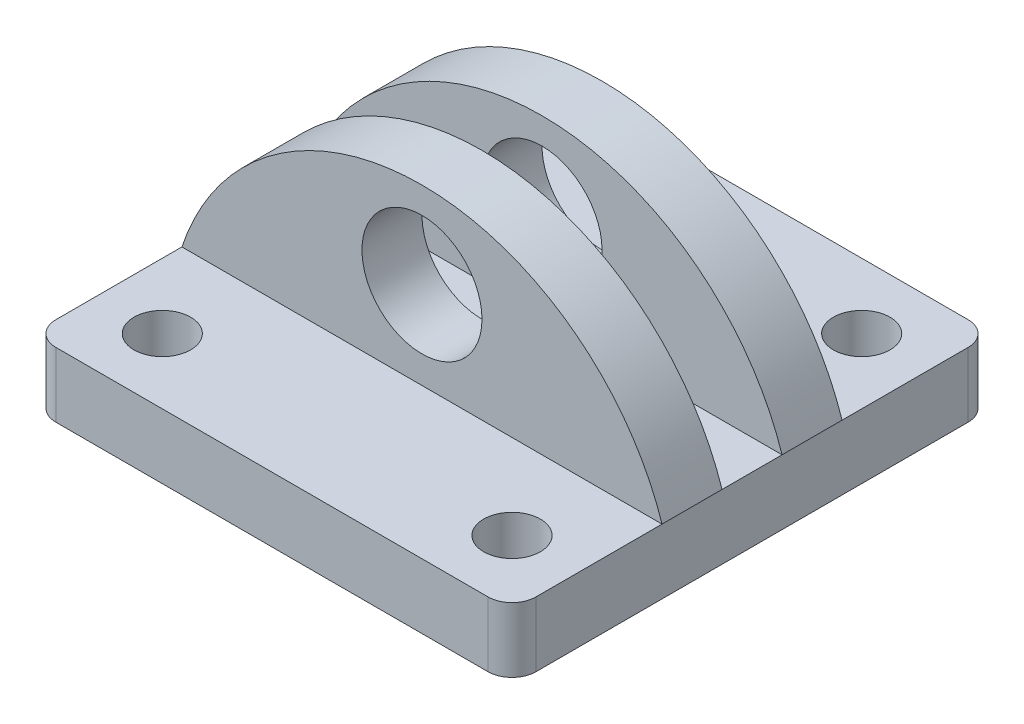
ISO-10303-21;
HEADER;
FILE_DESCRIPTION(('STEP AP214'),'2;1');
FILE_NAME('part.step','',(''),(''),'','','');
FILE_SCHEMA(('AUTOMOTIVE_DESIGN { 1 0 10303 214 1 1 1 1 }'));
ENDSEC;
DATA;
#1=APPLICATION_CONTEXT('core data for automotive mechanical design processes');
#2=APPLICATION_PROTOCOL_DEFINITION('international standard','automotive_design',2000,#1);
#3=PRODUCT_CONTEXT('',#1,'mechanical');
#4=PRODUCT('Part','Part','',(#3));
#5=PRODUCT_RELATED_PRODUCT_CATEGORY('part','',(#4));
#6=PRODUCT_DEFINITION_FORMATION('','',#4);
#7=PRODUCT_DEFINITION_CONTEXT('part definition',#1,'design');
#8=PRODUCT_DEFINITION('design','',#6,#7);
#9=PRODUCT_DEFINITION_SHAPE('','',#8);
#10=(LENGTH_UNIT() NAMED_UNIT(*) SI_UNIT(.MILLI.,.METRE.));
#11=(NAMED_UNIT(*) PLANE_ANGLE_UNIT() SI_UNIT($,.RADIAN.));
#12=(NAMED_UNIT(*) SI_UNIT($,.STERADIAN.) SOLID_ANGLE_UNIT());
#13=UNCERTAINTY_MEASURE_WITH_UNIT(LENGTH_MEASURE(1.E-05),#10,'distance_accuracy_value','');
#14=(GEOMETRIC_REPRESENTATION_CONTEXT(3) GLOBAL_UNCERTAINTY_ASSIGNED_CONTEXT((#13)) GLOBAL_UNIT_ASSIGNED_CONTEXT((#10,
#11,#12)) REPRESENTATION_CONTEXT('',''));
#15=CARTESIAN_POINT('',(0.,0.,0.));
#16=DIRECTION('',(0.,0.,1.));
#17=DIRECTION('',(1.,0.,0.));
#18=AXIS2_PLACEMENT_3D('',#15,#16,#17);
#19=CARTESIAN_POINT('',(0.,16.1032174785401,-15.367));
#20=DIRECTION('',(0.,0.,1.));
#21=DIRECTION('',(1.,0.,0.));
#22=AXIS2_PLACEMENT_3D('',#19,#20,#21);
#23=CYLINDRICAL_SURFACE('',#22,6.35);
#24=CARTESIAN_POINT('',(0.,16.1032174785401,9.52499999999999));
#25=DIRECTION('',(0.,0.,1.));
#26=DIRECTION('',(1.,0.,0.));
#27=AXIS2_PLACEMENT_3D('',#24,#25,#26);
#28=CIRCLE('',#27,6.35);
#29=CARTESIAN_POINT('',(6.34999999999999,16.1032174785401,9.52499999999999));
#30=VERTEX_POINT('',#29);
#31=EDGE_CURVE('E191',#30,#30,#28,.T.);
#32=ORIENTED_EDGE('',*,*,#31,.T.);
#33=EDGE_LOOP('',(#32));
#34=FACE_BOUND('',#33,.T.);
#35=CARTESIAN_POINT('',(0.,16.1032174785401,3.17499999999999));
#36=DIRECTION('',(0.,0.,-1.));
#37=DIRECTION('',(0.,1.,0.));
#38=AXIS2_PLACEMENT_3D('',#35,#36,#37);
#39=CIRCLE('',#38,6.35);
#40=CARTESIAN_POINT('',(0.,22.4532174785401,3.17499999999999));
#41=VERTEX_POINT('',#40);
#42=EDGE_CURVE('E187',#41,#41,#39,.F.);
#43=ORIENTED_EDGE('',*,*,#42,.F.);
#44=EDGE_LOOP('',(#43));
#45=FACE_BOUND('',#44,.T.);
#46=ADVANCED_FACE('F62',(#34,#45),#23,.F.);
#47=CARTESIAN_POINT('',(0.,-1.51143345808905,-15.367));
#48=DIRECTION('',(0.,0.,1.));
#49=DIRECTION('',(1.,0.,0.));
#50=AXIS2_PLACEMENT_3D('',#47,#48,#49);
#51=CYLINDRICAL_SURFACE('',#50,26.7433620999563);
#52=DIRECTION('',(0.,0.,1.));
#53=VECTOR('',#52,1.);
#54=CARTESIAN_POINT('',(25.4,6.858,-15.367));
#55=LINE('',#54,#53);
#56=CARTESIAN_POINT('',(25.4,6.858,3.17499999999999));
#57=VERTEX_POINT('',#56);
#58=CARTESIAN_POINT('',(25.4,6.858,9.52499999999999));
#59=VERTEX_POINT('',#58);
#60=EDGE_CURVE('E175',#57,#59,#55,.T.);
#61=ORIENTED_EDGE('',*,*,#60,.F.);
#62=CARTESIAN_POINT('',(0.,-1.51143345808905,3.17499999999999));
#63=DIRECTION('',(0.,0.,-1.));
#64=DIRECTION('',(0.,1.,0.));
#65=AXIS2_PLACEMENT_3D('',#62,#63,#64);
#66=CIRCLE('',#65,26.7433620999563);
#67=CARTESIAN_POINT('',(-25.4,6.858,3.17499999999999));
#68=VERTEX_POINT('',#67);
#69=EDGE_CURVE('E12',#68,#57,#66,.T.);
#70=ORIENTED_EDGE('',*,*,#69,.F.);
#71=DIRECTION('',(0.,0.,1.));
#72=VECTOR('',#71,1.);
#73=CARTESIAN_POINT('',(-25.4,6.858,-15.367));
#74=LINE('',#73,#72);
#75=CARTESIAN_POINT('',(-25.4,6.858,9.52499999999999));
#76=VERTEX_POINT('',#75);
#77=EDGE_CURVE('E173',#68,#76,#74,.T.);
#78=ORIENTED_EDGE('',*,*,#77,.T.);
#79=CARTESIAN_POINT('',(0.,-1.51143345808905,9.52499999999999));
#80=DIRECTION('',(0.,0.,1.));
#81=DIRECTION('',(1.,0.,0.));
#82=AXIS2_PLACEMENT_3D('',#79,#80,#81);
#83=CIRCLE('',#82,26.7433620999563);
#84=EDGE_CURVE('E183',#76,#59,#83,.F.);
#85=ORIENTED_EDGE('',*,*,#84,.T.);
#86=EDGE_LOOP('',(#61,#70,#78,#85));
#87=FACE_BOUND('',#86,.T.);
#88=ADVANCED_FACE('F171',(#87),#51,.T.);
#89=CARTESIAN_POINT('',(0.,-1.51143345808905,-3.17500000000001));
#90=DIRECTION('',(0.,0.,-1.));
#91=DIRECTION('',(0.,1.,0.));
#92=AXIS2_PLACEMENT_3D('',#89,#90,#91);
#93=CIRCLE('',#92,26.7433620999563);
#94=CARTESIAN_POINT('',(-25.4,6.858,-3.17500000000001));
#95=VERTEX_POINT('',#94);
#96=CARTESIAN_POINT('',(25.4,6.85799999999999,-3.17500000000001));
#97=VERTEX_POINT('',#96);
#98=EDGE_CURVE('E71',#95,#97,#93,.T.);
#99=ORIENTED_EDGE('',*,*,#98,.T.);
#100=CARTESIAN_POINT('',(25.4,6.858,-9.52500000000001));
#101=VERTEX_POINT('',#100);
#102=EDGE_CURVE('E86',#101,#97,#55,.T.);
#103=ORIENTED_EDGE('',*,*,#102,.F.);
#104=CARTESIAN_POINT('',(0.,-1.51143345808905,-9.52500000000001));
#105=DIRECTION('',(0.,0.,1.));
#106=DIRECTION('',(1.,0.,0.));
#107=AXIS2_PLACEMENT_3D('',#104,#105,#106);
#108=CIRCLE('',#107,26.7433620999563);
#109=CARTESIAN_POINT('',(-25.4,6.858,-9.52500000000001));
#110=VERTEX_POINT('',#109);
#111=EDGE_CURVE('E320',#110,#101,#108,.F.);
#112=ORIENTED_EDGE('',*,*,#111,.F.);
#113=EDGE_CURVE('E182',#110,#95,#74,.T.);
#114=ORIENTED_EDGE('',*,*,#113,.T.);
#115=EDGE_LOOP('',(#99,#103,#112,#114));
#116=FACE_BOUND('',#115,.T.);
#117=ADVANCED_FACE('F326',(#116),#51,.T.);
#118=CARTESIAN_POINT('',(-22.86,6.858,22.86));
#119=DIRECTION('',(0.,1.,0.));
#120=DIRECTION('',(0.,0.,1.));
#121=AXIS2_PLACEMENT_3D('',#118,#119,#120);
#122=PLANE('',#121);
#123=DIRECTION('',(-1.,0.,0.));
#124=VECTOR('',#123,1.);
#125=CARTESIAN_POINT('',(0.,6.858,-9.52500000000001));
#126=LINE('',#125,#124);
#127=EDGE_CURVE('E200',#101,#110,#126,.T.);
#128=ORIENTED_EDGE('',*,*,#127,.F.);
#129=DIRECTION('',(0.,0.,-1.));
#130=VECTOR('',#129,1.);
#131=CARTESIAN_POINT('',(25.4,6.858,22.86));
#132=LINE('',#131,#130);
#133=CARTESIAN_POINT('',(25.4,6.858,-22.86));
#134=VERTEX_POINT('',#133);
#135=EDGE_CURVE('E248',#101,#134,#132,.T.);
#136=ORIENTED_EDGE('',*,*,#135,.T.);
#137=CARTESIAN_POINT('',(22.86,6.858,-22.86));
#138=DIRECTION('',(0.,1.,0.));
#139=DIRECTION('',(0.,0.,1.));
#140=AXIS2_PLACEMENT_3D('',#137,#138,#139);
#141=CIRCLE('',#140,2.54);
#142=CARTESIAN_POINT('',(22.86,6.858,-25.4));
#143=VERTEX_POINT('',#142);
#144=EDGE_CURVE('E253',#134,#143,#141,.T.);
#145=ORIENTED_EDGE('',*,*,#144,.T.);
#146=DIRECTION('',(-1.,0.,0.));
#147=VECTOR('',#146,1.);
#148=CARTESIAN_POINT('',(22.86,6.858,-25.4));
#149=LINE('',#148,#147);
#150=CARTESIAN_POINT('',(-22.86,6.858,-25.4));
#151=VERTEX_POINT('',#150);
#152=EDGE_CURVE('E256',#143,#151,#149,.T.);
#153=ORIENTED_EDGE('',*,*,#152,.T.);
#154=CARTESIAN_POINT('',(-22.86,6.858,-22.86));
#155=DIRECTION('',(0.,1.,0.));
#156=DIRECTION('',(0.,0.,1.));
#157=AXIS2_PLACEMENT_3D('',#154,#155,#156);
#158=CIRCLE('',#157,2.54);
#159=CARTESIAN_POINT('',(-25.4,6.858,-22.86));
#160=VERTEX_POINT('',#159);
#161=EDGE_CURVE('E259',#151,#160,#158,.T.);
#162=ORIENTED_EDGE('',*,*,#161,.T.);
#163=DIRECTION('',(0.,0.,1.));
#164=VECTOR('',#163,1.);
#165=CARTESIAN_POINT('',(-25.4,6.858,22.86));
#166=LINE('',#165,#164);
#167=EDGE_CURVE('E262',#160,#110,#166,.T.);
#168=ORIENTED_EDGE('',*,*,#167,.T.);
#169=EDGE_LOOP('',(#128,#136,#145,#153,#162,#168));
#170=FACE_BOUND('',#169,.T.);
#171=CARTESIAN_POINT('',(18.499963,6.858,-18.499963));
#172=DIRECTION('',(0.,1.,0.));
#173=DIRECTION('',(0.,0.,1.));
#174=AXIS2_PLACEMENT_3D('',#171,#172,#173);
#175=CIRCLE('',#174,2.999994);
#176=CARTESIAN_POINT('',(18.499963,6.858,-15.499969));
#177=VERTEX_POINT('',#176);
#178=EDGE_CURVE('E221',#177,#177,#175,.T.);
#179=ORIENTED_EDGE('',*,*,#178,.F.);
#180=EDGE_LOOP('',(#179));
#181=FACE_BOUND('',#180,.T.);
#182=CARTESIAN_POINT('',(-18.499963,6.858,-18.499963));
#183=DIRECTION('',(0.,1.,0.));
#184=DIRECTION('',(0.,0.,1.));
#185=AXIS2_PLACEMENT_3D('',#182,#183,#184);
#186=CIRCLE('',#185,2.999994);
#187=CARTESIAN_POINT('',(-18.499963,6.858,-15.499969));
#188=VERTEX_POINT('',#187);
#189=EDGE_CURVE('E229',#188,#188,#186,.T.);
#190=ORIENTED_EDGE('',*,*,#189,.F.);
#191=EDGE_LOOP('',(#190));
#192=FACE_BOUND('',#191,.T.);
#193=ADVANCED_FACE('F388',(#170,#181,#192),#122,.T.);
#194=DIRECTION('',(1.,0.,0.));
#195=VECTOR('',#194,1.);
#196=CARTESIAN_POINT('',(0.,6.858,9.52499999999999));
#197=LINE('',#196,#195);
#198=EDGE_CURVE('E196',#76,#59,#197,.T.);
#199=ORIENTED_EDGE('',*,*,#198,.F.);
#200=CARTESIAN_POINT('',(-25.4,6.858,22.86));
#201=VERTEX_POINT('',#200);
#202=EDGE_CURVE('E180',#76,#201,#166,.T.);
#203=ORIENTED_EDGE('',*,*,#202,.T.);
#204=CARTESIAN_POINT('',(-22.86,6.858,22.86));
#205=DIRECTION('',(0.,1.,0.));
#206=DIRECTION('',(0.,0.,1.));
#207=AXIS2_PLACEMENT_3D('',#204,#205,#206);
#208=CIRCLE('',#207,2.54);
#209=CARTESIAN_POINT('',(-22.86,6.858,25.4));
#210=VERTEX_POINT('',#209);
#211=EDGE_CURVE('E237',#201,#210,#208,.T.);
#212=ORIENTED_EDGE('',*,*,#211,.T.);
#213=DIRECTION('',(1.,0.,0.));
#214=VECTOR('',#213,1.);
#215=CARTESIAN_POINT('',(22.86,6.858,25.4));
#216=LINE('',#215,#214);
#217=CARTESIAN_POINT('',(22.86,6.858,25.4));
#218=VERTEX_POINT('',#217);
#219=EDGE_CURVE('E241',#210,#218,#216,.T.);
#220=ORIENTED_EDGE('',*,*,#219,.T.);
#221=CARTESIAN_POINT('',(22.86,6.858,22.86));
#222=DIRECTION('',(0.,1.,0.));
#223=DIRECTION('',(0.,0.,-1.));
#224=AXIS2_PLACEMENT_3D('',#221,#222,#223);
#225=CIRCLE('',#224,2.54);
#226=CARTESIAN_POINT('',(25.4,6.858,22.86));
#227=VERTEX_POINT('',#226);
#228=EDGE_CURVE('E245',#218,#227,#225,.T.);
#229=ORIENTED_EDGE('',*,*,#228,.T.);
#230=EDGE_CURVE('E249',#227,#59,#132,.T.);
#231=ORIENTED_EDGE('',*,*,#230,.T.);
#232=EDGE_LOOP('',(#199,#203,#212,#220,#229,#231));
#233=FACE_BOUND('',#232,.T.);
#234=CARTESIAN_POINT('',(18.499963,6.858,18.499963));
#235=DIRECTION('',(0.,1.,0.));
#236=DIRECTION('',(0.,0.,1.));
#237=AXIS2_PLACEMENT_3D('',#234,#235,#236);
#238=CIRCLE('',#237,2.999994);
#239=CARTESIAN_POINT('',(18.499963,6.858,21.499957));
#240=VERTEX_POINT('',#239);
#241=EDGE_CURVE('E213',#240,#240,#238,.T.);
#242=ORIENTED_EDGE('',*,*,#241,.F.);
#243=EDGE_LOOP('',(#242));
#244=FACE_BOUND('',#243,.T.);
#245=CARTESIAN_POINT('',(-18.499963,6.858,18.499963));
#246=DIRECTION('',(0.,1.,0.));
#247=DIRECTION('',(0.,0.,1.));
#248=AXIS2_PLACEMENT_3D('',#245,#246,#247);
#249=CIRCLE('',#248,2.999994);
#250=CARTESIAN_POINT('',(-18.499963,6.858,21.499957));
#251=VERTEX_POINT('',#250);
#252=EDGE_CURVE('E205',#251,#251,#249,.T.);
#253=ORIENTED_EDGE('',*,*,#252,.F.);
#254=EDGE_LOOP('',(#253));
#255=FACE_BOUND('',#254,.T.);
#256=ADVANCED_FACE('F344',(#233,#244,#255),#122,.T.);
#257=CARTESIAN_POINT('',(-22.86,0.,22.86));
#258=DIRECTION('',(0.,1.,0.));
#259=DIRECTION('',(0.,0.,1.));
#260=AXIS2_PLACEMENT_3D('',#257,#258,#259);
#261=PLANE('',#260);
#262=CARTESIAN_POINT('',(-22.86,0.,22.86));
#263=DIRECTION('',(0.,1.,0.));
#264=DIRECTION('',(0.,0.,1.));
#265=AXIS2_PLACEMENT_3D('',#262,#263,#264);
#266=CIRCLE('',#265,2.54);
#267=CARTESIAN_POINT('',(-25.4,0.,22.86));
#268=VERTEX_POINT('',#267);
#269=CARTESIAN_POINT('',(-22.86,0.,25.4));
#270=VERTEX_POINT('',#269);
#271=EDGE_CURVE('E233',#268,#270,#266,.T.);
#272=ORIENTED_EDGE('',*,*,#271,.F.);
#273=DIRECTION('',(0.,0.,1.));
#274=VECTOR('',#273,1.);
#275=CARTESIAN_POINT('',(-25.4,0.,22.86));
#276=LINE('',#275,#274);
#277=CARTESIAN_POINT('',(-25.4,0.,-22.86));
#278=VERTEX_POINT('',#277);
#279=EDGE_CURVE('E242',#278,#268,#276,.T.);
#280=ORIENTED_EDGE('',*,*,#279,.F.);
#281=CARTESIAN_POINT('',(-22.86,0.,-22.86));
#282=DIRECTION('',(0.,1.,0.));
#283=DIRECTION('',(0.,0.,1.));
#284=AXIS2_PLACEMENT_3D('',#281,#282,#283);
#285=CIRCLE('',#284,2.54);
#286=CARTESIAN_POINT('',(-22.86,0.,-25.4));
#287=VERTEX_POINT('',#286);
#288=EDGE_CURVE('E284',#287,#278,#285,.T.);
#289=ORIENTED_EDGE('',*,*,#288,.F.);
#290=DIRECTION('',(-1.,0.,0.));
#291=VECTOR('',#290,1.);
#292=CARTESIAN_POINT('',(22.86,0.,-25.4));
#293=LINE('',#292,#291);
#294=CARTESIAN_POINT('',(22.86,0.,-25.4));
#295=VERTEX_POINT('',#294);
#296=EDGE_CURVE('E281',#295,#287,#293,.T.);
#297=ORIENTED_EDGE('',*,*,#296,.F.);
#298=CARTESIAN_POINT('',(22.86,0.,-22.86));
#299=DIRECTION('',(0.,1.,0.));
#300=DIRECTION('',(0.,0.,1.));
#301=AXIS2_PLACEMENT_3D('',#298,#299,#300);
#302=CIRCLE('',#301,2.54);
#303=CARTESIAN_POINT('',(25.4,0.,-22.86));
#304=VERTEX_POINT('',#303);
#305=EDGE_CURVE('E278',#304,#295,#302,.T.);
#306=ORIENTED_EDGE('',*,*,#305,.F.);
#307=DIRECTION('',(0.,0.,-1.));
#308=VECTOR('',#307,1.);
#309=CARTESIAN_POINT('',(25.4,0.,22.86));
#310=LINE('',#309,#308);
#311=CARTESIAN_POINT('',(25.4,0.,22.86));
#312=VERTEX_POINT('',#311);
#313=EDGE_CURVE('E275',#312,#304,#310,.T.);
#314=ORIENTED_EDGE('',*,*,#313,.F.);
#315=CARTESIAN_POINT('',(22.86,0.,22.86));
#316=DIRECTION('',(0.,1.,0.));
#317=DIRECTION('',(0.,0.,-1.));
#318=AXIS2_PLACEMENT_3D('',#315,#316,#317);
#319=CIRCLE('',#318,2.54);
#320=CARTESIAN_POINT('',(22.86,0.,25.4));
#321=VERTEX_POINT('',#320);
#322=EDGE_CURVE('E272',#321,#312,#319,.T.);
#323=ORIENTED_EDGE('',*,*,#322,.F.);
#324=DIRECTION('',(1.,0.,0.));
#325=VECTOR('',#324,1.);
#326=CARTESIAN_POINT('',(22.86,0.,25.4));
#327=LINE('',#326,#325);
#328=EDGE_CURVE('E269',#270,#321,#327,.T.);
#329=ORIENTED_EDGE('',*,*,#328,.F.);
#330=EDGE_LOOP('',(#272,#280,#289,#297,#306,#314,#323,#329));
#331=FACE_BOUND('',#330,.T.);
#332=CARTESIAN_POINT('',(-18.499963,0.,-18.499963));
#333=DIRECTION('',(0.,1.,0.));
#334=DIRECTION('',(0.,0.,1.));
#335=AXIS2_PLACEMENT_3D('',#332,#333,#334);
#336=CIRCLE('',#335,2.999994);
#337=CARTESIAN_POINT('',(-18.499963,0.,-15.499969));
#338=VERTEX_POINT('',#337);
#339=EDGE_CURVE('E225',#338,#338,#336,.T.);
#340=ORIENTED_EDGE('',*,*,#339,.T.);
#341=EDGE_LOOP('',(#340));
#342=FACE_BOUND('',#341,.T.);
#343=CARTESIAN_POINT('',(18.499963,0.,-18.499963));
#344=DIRECTION('',(0.,1.,0.));
#345=DIRECTION('',(0.,0.,1.));
#346=AXIS2_PLACEMENT_3D('',#343,#344,#345);
#347=CIRCLE('',#346,2.999994);
#348=CARTESIAN_POINT('',(18.499963,0.,-15.499969));
#349=VERTEX_POINT('',#348);
#350=EDGE_CURVE('E217',#349,#349,#347,.T.);
#351=ORIENTED_EDGE('',*,*,#350,.T.);
#352=EDGE_LOOP('',(#351));
#353=FACE_BOUND('',#352,.T.);
#354=CARTESIAN_POINT('',(18.499963,0.,18.499963));
#355=DIRECTION('',(0.,1.,0.));
#356=DIRECTION('',(0.,0.,1.));
#357=AXIS2_PLACEMENT_3D('',#354,#355,#356);
#358=CIRCLE('',#357,2.999994);
#359=CARTESIAN_POINT('',(18.499963,0.,21.499957));
#360=VERTEX_POINT('',#359);
#361=EDGE_CURVE('E209',#360,#360,#358,.T.);
#362=ORIENTED_EDGE('',*,*,#361,.T.);
#363=EDGE_LOOP('',(#362));
#364=FACE_BOUND('',#363,.T.);
#365=CARTESIAN_POINT('',(-18.499963,0.,18.499963));
#366=DIRECTION('',(0.,1.,0.));
#367=DIRECTION('',(0.,0.,1.));
#368=AXIS2_PLACEMENT_3D('',#365,#366,#367);
#369=CIRCLE('',#368,2.999994);
#370=CARTESIAN_POINT('',(-18.499963,0.,21.499957));
#371=VERTEX_POINT('',#370);
#372=EDGE_CURVE('E204',#371,#371,#369,.T.);
#373=ORIENTED_EDGE('',*,*,#372,.T.);
#374=EDGE_LOOP('',(#373));
#375=FACE_BOUND('',#374,.T.);
#376=ADVANCED_FACE('F398',(#331,#342,#353,#364,#375),#261,.F.);
#377=CARTESIAN_POINT('',(-22.86,6.858,22.86));
#378=DIRECTION('',(0.,-1.,0.));
#379=DIRECTION('',(0.,0.,-1.));
#380=AXIS2_PLACEMENT_3D('',#377,#378,#379);
#381=CYLINDRICAL_SURFACE('',#380,2.54);
#382=ORIENTED_EDGE('',*,*,#271,.T.);
#383=DIRECTION('',(0.,-1.,0.));
#384=VECTOR('',#383,1.);
#385=CARTESIAN_POINT('',(-22.86,6.858,25.4));
#386=LINE('',#385,#384);
#387=EDGE_CURVE('E316',#210,#270,#386,.T.);
#388=ORIENTED_EDGE('',*,*,#387,.F.);
#389=ORIENTED_EDGE('',*,*,#211,.F.);
#390=DIRECTION('',(0.,-1.,0.));
#391=VECTOR('',#390,1.);
#392=CARTESIAN_POINT('',(-25.4,6.858,22.86));
#393=LINE('',#392,#391);
#394=EDGE_CURVE('E265',#201,#268,#393,.T.);
#395=ORIENTED_EDGE('',*,*,#394,.T.);
#396=EDGE_LOOP('',(#382,#388,#389,#395));
#397=FACE_BOUND('',#396,.T.);
#398=ADVANCED_FACE('F64',(#397),#381,.T.);
#399=CARTESIAN_POINT('',(22.86,6.858,25.4));
#400=DIRECTION('',(0.,0.,-1.));
#401=DIRECTION('',(-1.,0.,0.));
#402=AXIS2_PLACEMENT_3D('',#399,#400,#401);
#403=PLANE('',#402);
#404=ORIENTED_EDGE('',*,*,#328,.T.);
#405=DIRECTION('',(0.,-1.,0.));
#406=VECTOR('',#405,1.);
#407=CARTESIAN_POINT('',(22.86,6.858,25.4));
#408=LINE('',#407,#406);
#409=EDGE_CURVE('E312',#218,#321,#408,.T.);
#410=ORIENTED_EDGE('',*,*,#409,.F.);
#411=ORIENTED_EDGE('',*,*,#219,.F.);
#412=ORIENTED_EDGE('',*,*,#387,.T.);
#413=EDGE_LOOP('',(#404,#410,#411,#412));
#414=FACE_BOUND('',#413,.T.);
#415=ADVANCED_FACE('F409',(#414),#403,.F.);
#416=CARTESIAN_POINT('',(22.86,6.858,22.86));
#417=DIRECTION('',(0.,-1.,0.));
#418=DIRECTION('',(0.,0.,-1.));
#419=AXIS2_PLACEMENT_3D('',#416,#417,#418);
#420=CYLINDRICAL_SURFACE('',#419,2.54);
#421=ORIENTED_EDGE('',*,*,#322,.T.);
#422=DIRECTION('',(0.,-1.,0.));
#423=VECTOR('',#422,1.);
#424=CARTESIAN_POINT('',(25.4,6.858,22.86));
#425=LINE('',#424,#423);
#426=EDGE_CURVE('E308',#227,#312,#425,.T.);
#427=ORIENTED_EDGE('',*,*,#426,.F.);
#428=ORIENTED_EDGE('',*,*,#228,.F.);
#429=ORIENTED_EDGE('',*,*,#409,.T.);
#430=EDGE_LOOP('',(#421,#427,#428,#429));
#431=FACE_BOUND('',#430,.T.);
#432=ADVANCED_FACE('F411',(#431),#420,.T.);
#433=CARTESIAN_POINT('',(25.4,6.858,22.86));
#434=DIRECTION('',(-1.,0.,0.));
#435=DIRECTION('',(0.,0.,1.));
#436=AXIS2_PLACEMENT_3D('',#433,#434,#435);
#437=PLANE('',#436);
#438=ORIENTED_EDGE('',*,*,#135,.F.);
#439=ORIENTED_EDGE('',*,*,#102,.T.);
#440=EDGE_CURVE('E328',#97,#57,#55,.T.);
#441=ORIENTED_EDGE('',*,*,#440,.T.);
#442=ORIENTED_EDGE('',*,*,#60,.T.);
#443=ORIENTED_EDGE('',*,*,#230,.F.);
#444=ORIENTED_EDGE('',*,*,#426,.T.);
#445=ORIENTED_EDGE('',*,*,#313,.T.);
#446=DIRECTION('',(0.,-1.,0.));
#447=VECTOR('',#446,1.);
#448=CARTESIAN_POINT('',(25.4,6.858,-22.86));
#449=LINE('',#448,#447);
#450=EDGE_CURVE('E304',#134,#304,#449,.T.);
#451=ORIENTED_EDGE('',*,*,#450,.F.);
#452=EDGE_LOOP('',(#438,#439,#441,#442,#443,#444,#445,#451));
#453=FACE_BOUND('',#452,.T.);
#454=ADVANCED_FACE('F336',(#453),#437,.F.);
#455=CARTESIAN_POINT('',(22.86,6.858,-22.86));
#456=DIRECTION('',(0.,-1.,0.));
#457=DIRECTION('',(0.,0.,-1.));
#458=AXIS2_PLACEMENT_3D('',#455,#456,#457);
#459=CYLINDRICAL_SURFACE('',#458,2.54);
#460=ORIENTED_EDGE('',*,*,#305,.T.);
#461=DIRECTION('',(0.,-1.,0.));
#462=VECTOR('',#461,1.);
#463=CARTESIAN_POINT('',(22.86,6.858,-25.4));
#464=LINE('',#463,#462);
#465=EDGE_CURVE('E300',#143,#295,#464,.T.);
#466=ORIENTED_EDGE('',*,*,#465,.F.);
#467=ORIENTED_EDGE('',*,*,#144,.F.);
#468=ORIENTED_EDGE('',*,*,#450,.T.);
#469=EDGE_LOOP('',(#460,#466,#467,#468));
#470=FACE_BOUND('',#469,.T.);
#471=ADVANCED_FACE('F416',(#470),#459,.T.);
#472=CARTESIAN_POINT('',(22.86,6.858,-25.4));
#473=DIRECTION('',(0.,0.,1.));
#474=DIRECTION('',(1.,0.,0.));
#475=AXIS2_PLACEMENT_3D('',#472,#473,#474);
#476=PLANE('',#475);
#477=ORIENTED_EDGE('',*,*,#296,.T.);
#478=DIRECTION('',(0.,-1.,0.));
#479=VECTOR('',#478,1.);
#480=CARTESIAN_POINT('',(-22.86,6.858,-25.4));
#481=LINE('',#480,#479);
#482=EDGE_CURVE('E296',#151,#287,#481,.T.);
#483=ORIENTED_EDGE('',*,*,#482,.F.);
#484=ORIENTED_EDGE('',*,*,#152,.F.);
#485=ORIENTED_EDGE('',*,*,#465,.T.);
#486=EDGE_LOOP('',(#477,#483,#484,#485));
#487=FACE_BOUND('',#486,.T.);
#488=ADVANCED_FACE('F420',(#487),#476,.F.);
#489=CARTESIAN_POINT('',(-22.86,6.858,-22.86));
#490=DIRECTION('',(0.,-1.,0.));
#491=DIRECTION('',(0.,0.,-1.));
#492=AXIS2_PLACEMENT_3D('',#489,#490,#491);
#493=CYLINDRICAL_SURFACE('',#492,2.54);
#494=ORIENTED_EDGE('',*,*,#288,.T.);
#495=DIRECTION('',(0.,-1.,0.));
#496=VECTOR('',#495,1.);
#497=CARTESIAN_POINT('',(-25.4,6.858,-22.86));
#498=LINE('',#497,#496);
#499=EDGE_CURVE('E292',#160,#278,#498,.T.);
#500=ORIENTED_EDGE('',*,*,#499,.F.);
#501=ORIENTED_EDGE('',*,*,#161,.F.);
#502=ORIENTED_EDGE('',*,*,#482,.T.);
#503=EDGE_LOOP('',(#494,#500,#501,#502));
#504=FACE_BOUND('',#503,.T.);
#505=ADVANCED_FACE('F422',(#504),#493,.T.);
#506=CARTESIAN_POINT('',(-25.4,6.858,22.86));
#507=DIRECTION('',(1.,0.,0.));
#508=DIRECTION('',(0.,0.,-1.));
#509=AXIS2_PLACEMENT_3D('',#506,#507,#508);
#510=PLANE('',#509);
#511=ORIENTED_EDGE('',*,*,#202,.F.);
#512=ORIENTED_EDGE('',*,*,#77,.F.);
#513=DIRECTION('',(0.,0.,-1.));
#514=VECTOR('',#513,1.);
#515=CARTESIAN_POINT('',(-25.4,6.858,0.));
#516=LINE('',#515,#514);
#517=EDGE_CURVE('E162',#68,#95,#516,.T.);
#518=ORIENTED_EDGE('',*,*,#517,.T.);
#519=ORIENTED_EDGE('',*,*,#113,.F.);
#520=ORIENTED_EDGE('',*,*,#167,.F.);
#521=ORIENTED_EDGE('',*,*,#499,.T.);
#522=ORIENTED_EDGE('',*,*,#279,.T.);
#523=ORIENTED_EDGE('',*,*,#394,.F.);
#524=EDGE_LOOP('',(#511,#512,#518,#519,#520,#521,#522,#523));
#525=FACE_BOUND('',#524,.T.);
#526=ADVANCED_FACE('F178',(#525),#510,.F.);
#527=CARTESIAN_POINT('',(-18.499963,6.858,-18.499963));
#528=DIRECTION('',(0.,-1.,0.));
#529=DIRECTION('',(0.,0.,-1.));
#530=AXIS2_PLACEMENT_3D('',#527,#528,#529);
#531=CYLINDRICAL_SURFACE('',#530,2.999994);
#532=ORIENTED_EDGE('',*,*,#189,.T.);
#533=EDGE_LOOP('',(#532));
#534=FACE_BOUND('',#533,.T.);
#535=ORIENTED_EDGE('',*,*,#339,.F.);
#536=EDGE_LOOP('',(#535));
#537=FACE_BOUND('',#536,.T.);
#538=ADVANCED_FACE('F429',(#534,#537),#531,.F.);
#539=CARTESIAN_POINT('',(18.499963,6.858,-18.499963));
#540=DIRECTION('',(0.,-1.,0.));
#541=DIRECTION('',(0.,0.,-1.));
#542=AXIS2_PLACEMENT_3D('',#539,#540,#541);
#543=CYLINDRICAL_SURFACE('',#542,2.999994);
#544=ORIENTED_EDGE('',*,*,#178,.T.);
#545=EDGE_LOOP('',(#544));
#546=FACE_BOUND('',#545,.T.);
#547=ORIENTED_EDGE('',*,*,#350,.F.);
#548=EDGE_LOOP('',(#547));
#549=FACE_BOUND('',#548,.T.);
#550=ADVANCED_FACE('F451',(#546,#549),#543,.F.);
#551=CARTESIAN_POINT('',(18.499963,6.858,18.499963));
#552=DIRECTION('',(0.,-1.,0.));
#553=DIRECTION('',(0.,0.,-1.));
#554=AXIS2_PLACEMENT_3D('',#551,#552,#553);
#555=CYLINDRICAL_SURFACE('',#554,2.999994);
#556=ORIENTED_EDGE('',*,*,#241,.T.);
#557=EDGE_LOOP('',(#556));
#558=FACE_BOUND('',#557,.T.);
#559=ORIENTED_EDGE('',*,*,#361,.F.);
#560=EDGE_LOOP('',(#559));
#561=FACE_BOUND('',#560,.T.);
#562=ADVANCED_FACE('F362',(#558,#561),#555,.F.);
#563=CARTESIAN_POINT('',(-18.499963,6.858,18.499963));
#564=DIRECTION('',(0.,-1.,0.));
#565=DIRECTION('',(0.,0.,-1.));
#566=AXIS2_PLACEMENT_3D('',#563,#564,#565);
#567=CYLINDRICAL_SURFACE('',#566,2.999994);
#568=ORIENTED_EDGE('',*,*,#252,.T.);
#569=EDGE_LOOP('',(#568));
#570=FACE_BOUND('',#569,.T.);
#571=ORIENTED_EDGE('',*,*,#372,.F.);
#572=EDGE_LOOP('',(#571));
#573=FACE_BOUND('',#572,.T.);
#574=ADVANCED_FACE('F351',(#570,#573),#567,.F.);
#575=CARTESIAN_POINT('',(0.,31.75,9.52499999999999));
#576=DIRECTION('',(0.,0.,-1.));
#577=DIRECTION('',(-1.,0.,0.));
#578=AXIS2_PLACEMENT_3D('',#575,#576,#577);
#579=PLANE('',#578);
#580=ORIENTED_EDGE('',*,*,#31,.F.);
#581=EDGE_LOOP('',(#580));
#582=FACE_BOUND('',#581,.T.);
#583=ORIENTED_EDGE('',*,*,#198,.T.);
#584=ORIENTED_EDGE('',*,*,#84,.F.);
#585=EDGE_LOOP('',(#583,#584));
#586=FACE_BOUND('',#585,.T.);
#587=ADVANCED_FACE('F348',(#582,#586),#579,.F.);
#588=CARTESIAN_POINT('',(0.,31.75,-9.52500000000001));
#589=DIRECTION('',(0.,0.,1.));
#590=DIRECTION('',(1.,0.,0.));
#591=AXIS2_PLACEMENT_3D('',#588,#589,#590);
#592=PLANE('',#591);
#593=CARTESIAN_POINT('',(0.,16.1032174785401,-9.52500000000001));
#594=DIRECTION('',(0.,0.,1.));
#595=DIRECTION('',(1.,0.,0.));
#596=AXIS2_PLACEMENT_3D('',#593,#594,#595);
#597=CIRCLE('',#596,6.35);
#598=CARTESIAN_POINT('',(6.34999999999999,16.1032174785401,-9.52500000000001));
#599=VERTEX_POINT('',#598);
#600=EDGE_CURVE('E195',#599,#599,#597,.T.);
#601=ORIENTED_EDGE('',*,*,#600,.T.);
#602=EDGE_LOOP('',(#601));
#603=FACE_BOUND('',#602,.T.);
#604=ORIENTED_EDGE('',*,*,#127,.T.);
#605=ORIENTED_EDGE('',*,*,#111,.T.);
#606=EDGE_LOOP('',(#604,#605));
#607=FACE_BOUND('',#606,.T.);
#608=ADVANCED_FACE('F350',(#603,#607),#592,.F.);
#609=CARTESIAN_POINT('',(0.,16.1032174785401,-3.17500000000001));
#610=DIRECTION('',(0.,0.,-1.));
#611=DIRECTION('',(0.,1.,0.));
#612=AXIS2_PLACEMENT_3D('',#609,#610,#611);
#613=CIRCLE('',#612,6.35);
#614=CARTESIAN_POINT('',(0.,22.4532174785401,-3.17500000000001));
#615=VERTEX_POINT('',#614);
#616=EDGE_CURVE('E159',#615,#615,#613,.F.);
#617=ORIENTED_EDGE('',*,*,#616,.T.);
#618=EDGE_LOOP('',(#617));
#619=FACE_BOUND('',#618,.T.);
#620=ORIENTED_EDGE('',*,*,#600,.F.);
#621=EDGE_LOOP('',(#620));
#622=FACE_BOUND('',#621,.T.);
#623=ADVANCED_FACE('F358',(#619,#622),#23,.F.);
#624=CARTESIAN_POINT('',(32.766,0.,3.17499999999999));
#625=DIRECTION('',(0.,0.,-1.));
#626=DIRECTION('',(0.,1.,0.));
#627=AXIS2_PLACEMENT_3D('',#624,#625,#626);
#628=PLANE('',#627);
#629=ORIENTED_EDGE('',*,*,#69,.T.);
#630=DIRECTION('',(-1.,0.,0.));
#631=VECTOR('',#630,1.);
#632=CARTESIAN_POINT('',(32.766,6.858,3.17499999999999));
#633=LINE('',#632,#631);
#634=EDGE_CURVE('E153',#57,#68,#633,.T.);
#635=ORIENTED_EDGE('',*,*,#634,.T.);
#636=EDGE_LOOP('',(#629,#635));
#637=FACE_BOUND('',#636,.T.);
#638=ORIENTED_EDGE('',*,*,#42,.T.);
#639=EDGE_LOOP('',(#638));
#640=FACE_BOUND('',#639,.T.);
#641=ADVANCED_FACE('F154',(#637,#640),#628,.T.);
#642=CARTESIAN_POINT('',(32.766,6.858,0.));
#643=DIRECTION('',(0.,1.,0.));
#644=DIRECTION('',(0.,0.,1.));
#645=AXIS2_PLACEMENT_3D('',#642,#643,#644);
#646=PLANE('',#645);
#647=ORIENTED_EDGE('',*,*,#440,.F.);
#648=DIRECTION('',(-1.,0.,0.));
#649=VECTOR('',#648,1.);
#650=CARTESIAN_POINT('',(32.766,6.858,-3.17500000000001));
#651=LINE('',#650,#649);
#652=EDGE_CURVE('E78',#97,#95,#651,.T.);
#653=ORIENTED_EDGE('',*,*,#652,.T.);
#654=ORIENTED_EDGE('',*,*,#517,.F.);
#655=ORIENTED_EDGE('',*,*,#634,.F.);
#656=EDGE_LOOP('',(#647,#653,#654,#655));
#657=FACE_BOUND('',#656,.T.);
#658=ADVANCED_FACE('F163',(#657),#646,.T.);
#659=CARTESIAN_POINT('',(32.766,0.,-3.17500000000001));
#660=DIRECTION('',(0.,0.,-1.));
#661=DIRECTION('',(0.,1.,0.));
#662=AXIS2_PLACEMENT_3D('',#659,#660,#661);
#663=PLANE('',#662);
#664=ORIENTED_EDGE('',*,*,#98,.F.);
#665=ORIENTED_EDGE('',*,*,#652,.F.);
#666=EDGE_LOOP('',(#664,#665));
#667=FACE_BOUND('',#666,.T.);
#668=ORIENTED_EDGE('',*,*,#616,.F.);
#669=EDGE_LOOP('',(#668));
#670=FACE_BOUND('',#669,.T.);
#671=ADVANCED_FACE('F331',(#667,#670),#663,.F.);
#672=CLOSED_SHELL('',(#46,#88,#117,#193,#256,#376,#398,#415,#432,#454,#471,#488,#505,#526,#538,
#550,#562,#574,#587,#608,#623,#641,#658,#671));
#673=MANIFOLD_SOLID_BREP('B2',#672);
#674=ADVANCED_BREP_SHAPE_REPRESENTATION('',(#18,#673),#14);
#675=SHAPE_DEFINITION_REPRESENTATION(#9,#674);
ENDSEC;
END-ISO-10303-21;
